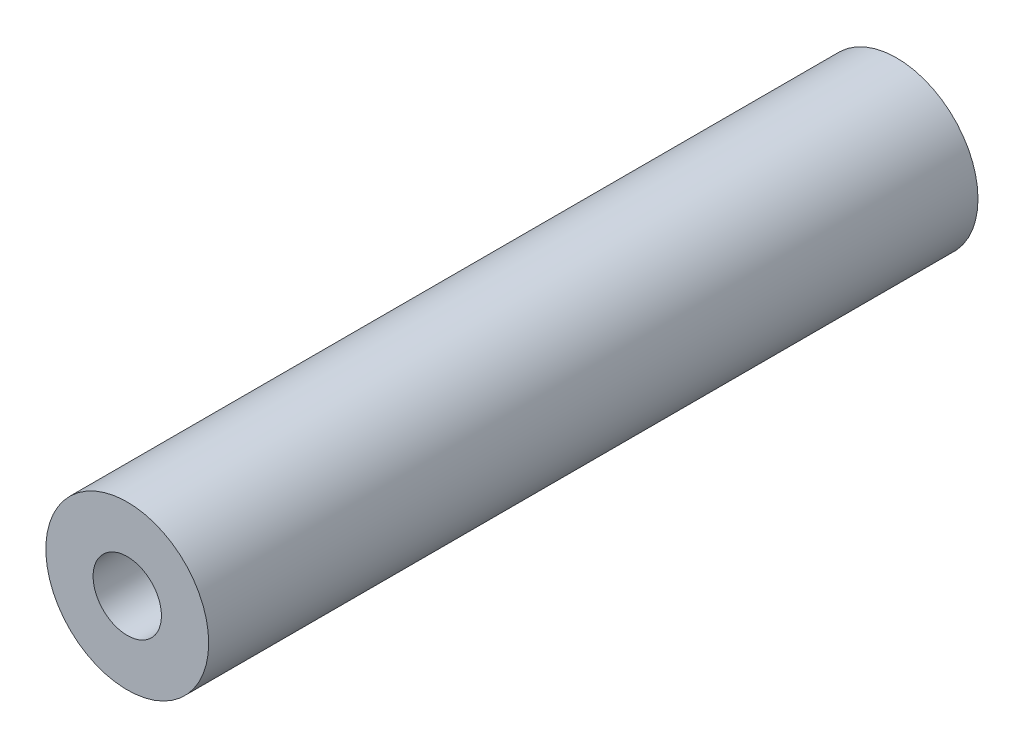
ISO-10303-21;
HEADER;
FILE_DESCRIPTION(('STEP AP214'),'2;1');
FILE_NAME('part.step','',(''),(''),'','','');
FILE_SCHEMA(('AUTOMOTIVE_DESIGN { 1 0 10303 214 1 1 1 1 }'));
ENDSEC;
DATA;
#1=APPLICATION_CONTEXT('core data for automotive mechanical design processes');
#2=APPLICATION_PROTOCOL_DEFINITION('international standard','automotive_design',2000,#1);
#3=PRODUCT_CONTEXT('',#1,'mechanical');
#4=PRODUCT('Part','Part','',(#3));
#5=PRODUCT_RELATED_PRODUCT_CATEGORY('part','',(#4));
#6=PRODUCT_DEFINITION_FORMATION('','',#4);
#7=PRODUCT_DEFINITION_CONTEXT('part definition',#1,'design');
#8=PRODUCT_DEFINITION('design','',#6,#7);
#9=PRODUCT_DEFINITION_SHAPE('','',#8);
#10=(LENGTH_UNIT() NAMED_UNIT(*) SI_UNIT(.MILLI.,.METRE.));
#11=(NAMED_UNIT(*) PLANE_ANGLE_UNIT() SI_UNIT($,.RADIAN.));
#12=(NAMED_UNIT(*) SI_UNIT($,.STERADIAN.) SOLID_ANGLE_UNIT());
#13=UNCERTAINTY_MEASURE_WITH_UNIT(LENGTH_MEASURE(1.E-05),#10,'distance_accuracy_value','');
#14=(GEOMETRIC_REPRESENTATION_CONTEXT(3) GLOBAL_UNCERTAINTY_ASSIGNED_CONTEXT((#13)) GLOBAL_UNIT_ASSIGNED_CONTEXT((#10,
#11,#12)) REPRESENTATION_CONTEXT('',''));
#15=CARTESIAN_POINT('',(0.,0.,0.));
#16=DIRECTION('',(0.,0.,1.));
#17=DIRECTION('',(1.,0.,0.));
#18=AXIS2_PLACEMENT_3D('',#15,#16,#17);
#19=CARTESIAN_POINT('',(0.,0.,60.));
#20=DIRECTION('',(0.,0.,1.));
#21=DIRECTION('',(1.,0.,0.));
#22=AXIS2_PLACEMENT_3D('',#19,#20,#21);
#23=PLANE('',#22);
#24=CARTESIAN_POINT('',(0.,0.,60.));
#25=DIRECTION('',(0.,0.,1.));
#26=DIRECTION('',(1.,0.,0.));
#27=AXIS2_PLACEMENT_3D('',#24,#25,#26);
#28=CIRCLE('',#27,6.35);
#29=CARTESIAN_POINT('',(6.35,0.,60.));
#30=VERTEX_POINT('',#29);
#31=EDGE_CURVE('E10',#30,#30,#28,.T.);
#32=ORIENTED_EDGE('',*,*,#31,.T.);
#33=EDGE_LOOP('',(#32));
#34=FACE_BOUND('',#33,.T.);
#35=CARTESIAN_POINT('',(0.,0.,60.));
#36=DIRECTION('',(0.,0.,1.));
#37=DIRECTION('',(1.,0.,0.));
#38=AXIS2_PLACEMENT_3D('',#35,#36,#37);
#39=CIRCLE('',#38,2.665);
#40=CARTESIAN_POINT('',(2.665,0.,60.));
#41=VERTEX_POINT('',#40);
#42=EDGE_CURVE('E42',#41,#41,#39,.T.);
#43=ORIENTED_EDGE('',*,*,#42,.F.);
#44=EDGE_LOOP('',(#43));
#45=FACE_BOUND('',#44,.T.);
#46=ADVANCED_FACE('F31',(#34,#45),#23,.T.);
#47=CARTESIAN_POINT('',(0.,0.,0.));
#48=DIRECTION('',(0.,0.,1.));
#49=DIRECTION('',(1.,0.,0.));
#50=AXIS2_PLACEMENT_3D('',#47,#48,#49);
#51=PLANE('',#50);
#52=CARTESIAN_POINT('',(0.,0.,0.));
#53=DIRECTION('',(0.,0.,1.));
#54=DIRECTION('',(1.,0.,0.));
#55=AXIS2_PLACEMENT_3D('',#52,#53,#54);
#56=CIRCLE('',#55,6.35);
#57=CARTESIAN_POINT('',(6.35,0.,0.));
#58=VERTEX_POINT('',#57);
#59=EDGE_CURVE('E35',#58,#58,#56,.T.);
#60=ORIENTED_EDGE('',*,*,#59,.F.);
#61=EDGE_LOOP('',(#60));
#62=FACE_BOUND('',#61,.T.);
#63=CARTESIAN_POINT('',(0.,0.,0.));
#64=DIRECTION('',(0.,0.,1.));
#65=DIRECTION('',(1.,0.,0.));
#66=AXIS2_PLACEMENT_3D('',#63,#64,#65);
#67=CIRCLE('',#66,2.665);
#68=CARTESIAN_POINT('',(2.665,0.,0.));
#69=VERTEX_POINT('',#68);
#70=EDGE_CURVE('E44',#69,#69,#67,.T.);
#71=ORIENTED_EDGE('',*,*,#70,.T.);
#72=EDGE_LOOP('',(#71));
#73=FACE_BOUND('',#72,.T.);
#74=ADVANCED_FACE('F54',(#62,#73),#51,.F.);
#75=CARTESIAN_POINT('',(0.,0.,60.));
#76=DIRECTION('',(0.,0.,-1.));
#77=DIRECTION('',(-1.,0.,0.));
#78=AXIS2_PLACEMENT_3D('',#75,#76,#77);
#79=CYLINDRICAL_SURFACE('',#78,6.35);
#80=ORIENTED_EDGE('',*,*,#31,.F.);
#81=EDGE_LOOP('',(#80));
#82=FACE_BOUND('',#81,.T.);
#83=ORIENTED_EDGE('',*,*,#59,.T.);
#84=EDGE_LOOP('',(#83));
#85=FACE_BOUND('',#84,.T.);
#86=ADVANCED_FACE('F33',(#82,#85),#79,.T.);
#87=CARTESIAN_POINT('',(0.,0.,60.));
#88=DIRECTION('',(0.,0.,-1.));
#89=DIRECTION('',(-1.,0.,0.));
#90=AXIS2_PLACEMENT_3D('',#87,#88,#89);
#91=CYLINDRICAL_SURFACE('',#90,2.665);
#92=ORIENTED_EDGE('',*,*,#42,.T.);
#93=EDGE_LOOP('',(#92));
#94=FACE_BOUND('',#93,.T.);
#95=ORIENTED_EDGE('',*,*,#70,.F.);
#96=EDGE_LOOP('',(#95));
#97=FACE_BOUND('',#96,.T.);
#98=ADVANCED_FACE('F50',(#94,#97),#91,.F.);
#99=CLOSED_SHELL('',(#46,#74,#86,#98));
#100=MANIFOLD_SOLID_BREP('B2',#99);
#101=ADVANCED_BREP_SHAPE_REPRESENTATION('',(#18,#100),#14);
#102=SHAPE_DEFINITION_REPRESENTATION(#9,#101);
ENDSEC;
END-ISO-10303-21;
